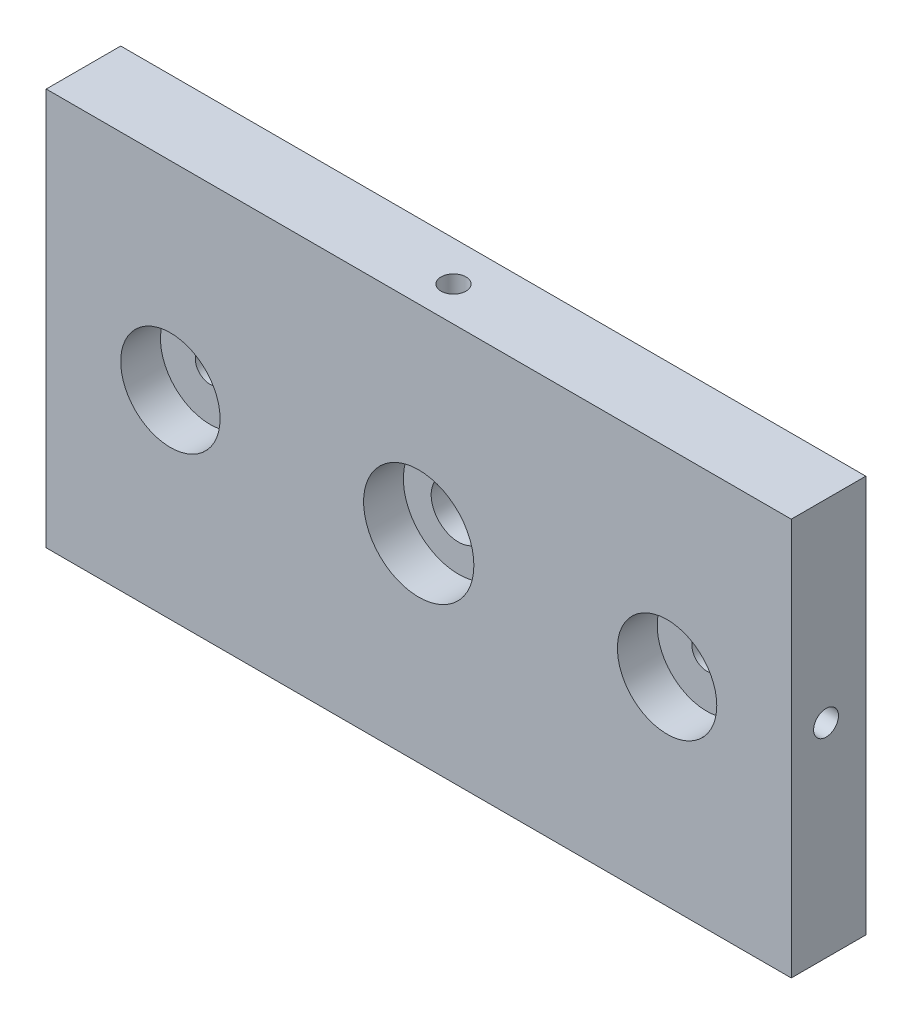
ISO-10303-21;
HEADER;
FILE_DESCRIPTION(('STEP AP214'),'2;1');
FILE_NAME('part.step','',(''),(''),'','','');
FILE_SCHEMA(('AUTOMOTIVE_DESIGN { 1 0 10303 214 1 1 1 1 }'));
ENDSEC;
DATA;
#1=APPLICATION_CONTEXT('core data for automotive mechanical design processes');
#2=APPLICATION_PROTOCOL_DEFINITION('international standard','automotive_design',2000,#1);
#3=PRODUCT_CONTEXT('',#1,'mechanical');
#4=PRODUCT('Part','Part','',(#3));
#5=PRODUCT_RELATED_PRODUCT_CATEGORY('part','',(#4));
#6=PRODUCT_DEFINITION_FORMATION('','',#4);
#7=PRODUCT_DEFINITION_CONTEXT('part definition',#1,'design');
#8=PRODUCT_DEFINITION('design','',#6,#7);
#9=PRODUCT_DEFINITION_SHAPE('','',#8);
#10=(LENGTH_UNIT() NAMED_UNIT(*) SI_UNIT(.MILLI.,.METRE.));
#11=(NAMED_UNIT(*) PLANE_ANGLE_UNIT() SI_UNIT($,.RADIAN.));
#12=(NAMED_UNIT(*) SI_UNIT($,.STERADIAN.) SOLID_ANGLE_UNIT());
#13=UNCERTAINTY_MEASURE_WITH_UNIT(LENGTH_MEASURE(1.E-05),#10,'distance_accuracy_value','');
#14=(GEOMETRIC_REPRESENTATION_CONTEXT(3) GLOBAL_UNCERTAINTY_ASSIGNED_CONTEXT((#13)) GLOBAL_UNIT_ASSIGNED_CONTEXT((#10,
#11,#12)) REPRESENTATION_CONTEXT('',''));
#15=CARTESIAN_POINT('',(0.,0.,0.));
#16=DIRECTION('',(0.,0.,1.));
#17=DIRECTION('',(1.,0.,0.));
#18=AXIS2_PLACEMENT_3D('',#15,#16,#17);
#19=CARTESIAN_POINT('',(-50.,0.,-0.000999999999999265));
#20=DIRECTION('',(0.,0.,1.));
#21=DIRECTION('',(1.,0.,0.));
#22=AXIS2_PLACEMENT_3D('',#19,#20,#21);
#23=CYLINDRICAL_SURFACE('',#22,3.);
#24=CARTESIAN_POINT('',(-50.,0.,7.));
#25=DIRECTION('',(0.,0.,1.));
#26=DIRECTION('',(1.,0.,0.));
#27=AXIS2_PLACEMENT_3D('',#24,#25,#26);
#28=CIRCLE('',#27,3.);
#29=CARTESIAN_POINT('',(-47.,0.,7.));
#30=VERTEX_POINT('',#29);
#31=EDGE_CURVE('E113',#30,#30,#28,.F.);
#32=CARTESIAN_POINT('',(-50.,0.,4.));
#33=DIRECTION('',(0.,0.,-1.));
#34=DIRECTION('',(-1.,0.,0.));
#35=AXIS2_PLACEMENT_3D('',#32,#33,#34);
#36=CIRCLE('',#35,3.);
#37=CARTESIAN_POINT('',(-47.,0.,4.));
#38=VERTEX_POINT('',#37);
#39=EDGE_CURVE('E38',#38,#38,#36,.F.);
#40=CARTESIAN_POINT('',(-47.,0.,7.));
#41=CARTESIAN_POINT('',(-47.,0.,6.96875));
#42=CARTESIAN_POINT('',(-47.,0.,6.9375));
#43=CARTESIAN_POINT('',(-47.,0.,6.875));
#44=CARTESIAN_POINT('',(-47.,0.,6.84375));
#45=CARTESIAN_POINT('',(-47.,0.,6.78125));
#46=CARTESIAN_POINT('',(-47.,0.,6.75));
#47=CARTESIAN_POINT('',(-47.,0.,6.6875));
#48=CARTESIAN_POINT('',(-47.,0.,6.65625));
#49=CARTESIAN_POINT('',(-47.,0.,6.59375));
#50=CARTESIAN_POINT('',(-47.,0.,6.5625));
#51=CARTESIAN_POINT('',(-47.,0.,6.5));
#52=CARTESIAN_POINT('',(-47.,0.,6.46875));
#53=CARTESIAN_POINT('',(-47.,0.,6.40625));
#54=CARTESIAN_POINT('',(-47.,0.,6.375));
#55=CARTESIAN_POINT('',(-47.,0.,6.3125));
#56=CARTESIAN_POINT('',(-47.,0.,6.28125));
#57=CARTESIAN_POINT('',(-47.,0.,6.21875));
#58=CARTESIAN_POINT('',(-47.,0.,6.1875));
#59=CARTESIAN_POINT('',(-47.,0.,6.125));
#60=CARTESIAN_POINT('',(-47.,0.,6.09375));
#61=CARTESIAN_POINT('',(-47.,0.,6.03125));
#62=CARTESIAN_POINT('',(-47.,0.,6.));
#63=CARTESIAN_POINT('',(-47.,0.,5.9375));
#64=CARTESIAN_POINT('',(-47.,0.,5.90625));
#65=CARTESIAN_POINT('',(-47.,0.,5.84375));
#66=CARTESIAN_POINT('',(-47.,0.,5.8125));
#67=CARTESIAN_POINT('',(-47.,0.,5.75));
#68=CARTESIAN_POINT('',(-47.,0.,5.71875));
#69=CARTESIAN_POINT('',(-47.,0.,5.65625));
#70=CARTESIAN_POINT('',(-47.,0.,5.625));
#71=CARTESIAN_POINT('',(-47.,0.,5.5625));
#72=CARTESIAN_POINT('',(-47.,0.,5.53125));
#73=CARTESIAN_POINT('',(-47.,0.,5.46875));
#74=CARTESIAN_POINT('',(-47.,0.,5.4375));
#75=CARTESIAN_POINT('',(-47.,0.,5.375));
#76=CARTESIAN_POINT('',(-47.,0.,5.34375));
#77=CARTESIAN_POINT('',(-47.,0.,5.28125));
#78=CARTESIAN_POINT('',(-47.,0.,5.25));
#79=CARTESIAN_POINT('',(-47.,0.,5.1875));
#80=CARTESIAN_POINT('',(-47.,0.,5.15625));
#81=CARTESIAN_POINT('',(-47.,0.,5.09375));
#82=CARTESIAN_POINT('',(-47.,0.,5.0625));
#83=CARTESIAN_POINT('',(-47.,0.,5.));
#84=CARTESIAN_POINT('',(-47.,0.,4.96875));
#85=CARTESIAN_POINT('',(-47.,0.,4.90625));
#86=CARTESIAN_POINT('',(-47.,0.,4.875));
#87=CARTESIAN_POINT('',(-47.,0.,4.8125));
#88=CARTESIAN_POINT('',(-47.,0.,4.78125));
#89=CARTESIAN_POINT('',(-47.,0.,4.71875));
#90=CARTESIAN_POINT('',(-47.,0.,4.6875));
#91=CARTESIAN_POINT('',(-47.,0.,4.625));
#92=CARTESIAN_POINT('',(-47.,0.,4.59375));
#93=CARTESIAN_POINT('',(-47.,0.,4.53125));
#94=CARTESIAN_POINT('',(-47.,0.,4.5));
#95=CARTESIAN_POINT('',(-47.,0.,4.4375));
#96=CARTESIAN_POINT('',(-47.,0.,4.40625));
#97=CARTESIAN_POINT('',(-47.,0.,4.34375));
#98=CARTESIAN_POINT('',(-47.,0.,4.3125));
#99=CARTESIAN_POINT('',(-47.,0.,4.25));
#100=CARTESIAN_POINT('',(-47.,0.,4.21875));
#101=CARTESIAN_POINT('',(-47.,0.,4.15625));
#102=CARTESIAN_POINT('',(-47.,0.,4.125));
#103=CARTESIAN_POINT('',(-47.,0.,4.0625));
#104=CARTESIAN_POINT('',(-47.,0.,4.03125));
#105=CARTESIAN_POINT('',(-47.,0.,4.));
#106=B_SPLINE_CURVE_WITH_KNOTS('',3,(#40,#41,#42,#43,#44,#45,#46,#47,#48,#49,#50,#51,#52,#53,
#54,#55,#56,#57,#58,#59,#60,#61,#62,#63,#64,#65,#66,#67,#68,#69,#70,#71,#72,#73,#74,#75,#76,#77,
#78,#79,#80,#81,#82,#83,#84,#85,#86,#87,#88,#89,#90,#91,#92,#93,#94,#95,#96,#97,#98,#99,#100,
#101,#102,#103,#104,#105),.UNSPECIFIED.,.F.,.F.,(4,2,2,2,2,2,2,2,2,2,2,2,2,2,2,2,2,2,2,2,2,2,2,
2,2,2,2,2,2,2,2,2,4),(0.,0.0937500000000001,0.1875,0.281249999999999,0.374999999999999,0.46875,
0.5625,0.65625,0.749999999999999,0.843749999999999,0.937499999999999,1.03125,1.125,1.21875,
1.3125,1.40625,1.5,1.59375,1.6875,1.78125,1.875,1.96875,2.0625,2.15625,2.25,2.34375,2.4375,
2.53125,2.625,2.71875,2.8125,2.90625,3.),.UNSPECIFIED.);
#107=EDGE_CURVE('BSEAM34',#30,#38,#106,.T.);
#108=ORIENTED_EDGE('',*,*,#31,.F.);
#109=ORIENTED_EDGE('',*,*,#39,.F.);
#110=ORIENTED_EDGE('',*,*,#107,.T.);
#111=ORIENTED_EDGE('',*,*,#107,.F.);
#112=EDGE_LOOP('',(#108,#110,#109,#111));
#113=FACE_BOUND('',#112,.T.);
#114=ADVANCED_FACE('F34',(#113),#23,.F.);
#115=CARTESIAN_POINT('',(50.,0.,-0.000999999999999265));
#116=DIRECTION('',(0.,0.,1.));
#117=DIRECTION('',(1.,0.,0.));
#118=AXIS2_PLACEMENT_3D('',#115,#116,#117);
#119=CYLINDRICAL_SURFACE('',#118,3.);
#120=CARTESIAN_POINT('',(50.,0.,7.));
#121=DIRECTION('',(0.,0.,1.));
#122=DIRECTION('',(1.,0.,0.));
#123=AXIS2_PLACEMENT_3D('',#120,#121,#122);
#124=CIRCLE('',#123,3.);
#125=CARTESIAN_POINT('',(53.,0.,7.));
#126=VERTEX_POINT('',#125);
#127=EDGE_CURVE('E110',#126,#126,#124,.F.);
#128=CARTESIAN_POINT('',(50.,0.,4.));
#129=DIRECTION('',(0.,0.,-1.));
#130=DIRECTION('',(-1.,0.,0.));
#131=AXIS2_PLACEMENT_3D('',#128,#129,#130);
#132=CIRCLE('',#131,3.);
#133=CARTESIAN_POINT('',(53.,0.,4.));
#134=VERTEX_POINT('',#133);
#135=EDGE_CURVE('E119',#134,#134,#132,.F.);
#136=CARTESIAN_POINT('',(53.,0.,7.));
#137=CARTESIAN_POINT('',(53.,0.,6.96875));
#138=CARTESIAN_POINT('',(53.,0.,6.9375));
#139=CARTESIAN_POINT('',(53.,0.,6.875));
#140=CARTESIAN_POINT('',(53.,0.,6.84375));
#141=CARTESIAN_POINT('',(53.,0.,6.78125));
#142=CARTESIAN_POINT('',(53.,0.,6.75));
#143=CARTESIAN_POINT('',(53.,0.,6.6875));
#144=CARTESIAN_POINT('',(53.,0.,6.65625));
#145=CARTESIAN_POINT('',(53.,0.,6.59375));
#146=CARTESIAN_POINT('',(53.,0.,6.5625));
#147=CARTESIAN_POINT('',(53.,0.,6.5));
#148=CARTESIAN_POINT('',(53.,0.,6.46875));
#149=CARTESIAN_POINT('',(53.,0.,6.40625));
#150=CARTESIAN_POINT('',(53.,0.,6.375));
#151=CARTESIAN_POINT('',(53.,0.,6.3125));
#152=CARTESIAN_POINT('',(53.,0.,6.28125));
#153=CARTESIAN_POINT('',(53.,0.,6.21875));
#154=CARTESIAN_POINT('',(53.,0.,6.1875));
#155=CARTESIAN_POINT('',(53.,0.,6.125));
#156=CARTESIAN_POINT('',(53.,0.,6.09375));
#157=CARTESIAN_POINT('',(53.,0.,6.03125));
#158=CARTESIAN_POINT('',(53.,0.,6.));
#159=CARTESIAN_POINT('',(53.,0.,5.9375));
#160=CARTESIAN_POINT('',(53.,0.,5.90625));
#161=CARTESIAN_POINT('',(53.,0.,5.84375));
#162=CARTESIAN_POINT('',(53.,0.,5.8125));
#163=CARTESIAN_POINT('',(53.,0.,5.75));
#164=CARTESIAN_POINT('',(53.,0.,5.71875));
#165=CARTESIAN_POINT('',(53.,0.,5.65625));
#166=CARTESIAN_POINT('',(53.,0.,5.625));
#167=CARTESIAN_POINT('',(53.,0.,5.5625));
#168=CARTESIAN_POINT('',(53.,0.,5.53125));
#169=CARTESIAN_POINT('',(53.,0.,5.46875));
#170=CARTESIAN_POINT('',(53.,0.,5.4375));
#171=CARTESIAN_POINT('',(53.,0.,5.375));
#172=CARTESIAN_POINT('',(53.,0.,5.34375));
#173=CARTESIAN_POINT('',(53.,0.,5.28125));
#174=CARTESIAN_POINT('',(53.,0.,5.25));
#175=CARTESIAN_POINT('',(53.,0.,5.1875));
#176=CARTESIAN_POINT('',(53.,0.,5.15625));
#177=CARTESIAN_POINT('',(53.,0.,5.09375));
#178=CARTESIAN_POINT('',(53.,0.,5.0625));
#179=CARTESIAN_POINT('',(53.,0.,5.));
#180=CARTESIAN_POINT('',(53.,0.,4.96875));
#181=CARTESIAN_POINT('',(53.,0.,4.90625));
#182=CARTESIAN_POINT('',(53.,0.,4.875));
#183=CARTESIAN_POINT('',(53.,0.,4.8125));
#184=CARTESIAN_POINT('',(53.,0.,4.78125));
#185=CARTESIAN_POINT('',(53.,0.,4.71875));
#186=CARTESIAN_POINT('',(53.,0.,4.6875));
#187=CARTESIAN_POINT('',(53.,0.,4.625));
#188=CARTESIAN_POINT('',(53.,0.,4.59375));
#189=CARTESIAN_POINT('',(53.,0.,4.53125));
#190=CARTESIAN_POINT('',(53.,0.,4.5));
#191=CARTESIAN_POINT('',(53.,0.,4.4375));
#192=CARTESIAN_POINT('',(53.,0.,4.40625));
#193=CARTESIAN_POINT('',(53.,0.,4.34375));
#194=CARTESIAN_POINT('',(53.,0.,4.3125));
#195=CARTESIAN_POINT('',(53.,0.,4.25));
#196=CARTESIAN_POINT('',(53.,0.,4.21875));
#197=CARTESIAN_POINT('',(53.,0.,4.15625));
#198=CARTESIAN_POINT('',(53.,0.,4.125));
#199=CARTESIAN_POINT('',(53.,0.,4.0625));
#200=CARTESIAN_POINT('',(53.,0.,4.03125));
#201=CARTESIAN_POINT('',(53.,0.,4.));
#202=B_SPLINE_CURVE_WITH_KNOTS('',3,(#136,#137,#138,#139,#140,#141,#142,#143,#144,#145,#146,
#147,#148,#149,#150,#151,#152,#153,#154,#155,#156,#157,#158,#159,#160,#161,#162,#163,#164,#165,
#166,#167,#168,#169,#170,#171,#172,#173,#174,#175,#176,#177,#178,#179,#180,#181,#182,#183,#184,
#185,#186,#187,#188,#189,#190,#191,#192,#193,#194,#195,#196,#197,#198,#199,#200,#201),
.UNSPECIFIED.,.F.,.F.,(4,2,2,2,2,2,2,2,2,2,2,2,2,2,2,2,2,2,2,2,2,2,2,2,2,2,2,2,2,2,2,2,4),(0.,
0.0937500000000001,0.1875,0.281249999999999,0.374999999999999,0.46875,0.5625,0.65625,
0.749999999999999,0.843749999999999,0.937499999999999,1.03125,1.125,1.21875,1.3125,1.40625,1.5,
1.59375,1.6875,1.78125,1.875,1.96875,2.0625,2.15625,2.25,2.34375,2.4375,2.53125,2.625,2.71875,
2.8125,2.90625,3.),.UNSPECIFIED.);
#203=EDGE_CURVE('BSEAM188',#126,#134,#202,.T.);
#204=ORIENTED_EDGE('',*,*,#127,.F.);
#205=ORIENTED_EDGE('',*,*,#135,.F.);
#206=ORIENTED_EDGE('',*,*,#203,.T.);
#207=ORIENTED_EDGE('',*,*,#203,.F.);
#208=EDGE_LOOP('',(#204,#206,#205,#207));
#209=FACE_BOUND('',#208,.T.);
#210=ADVANCED_FACE('F188',(#209),#119,.F.);
#211=CARTESIAN_POINT('',(0.,0.,-0.000999999999999265));
#212=DIRECTION('',(0.,0.,1.));
#213=DIRECTION('',(1.,0.,0.));
#214=AXIS2_PLACEMENT_3D('',#211,#212,#213);
#215=CYLINDRICAL_SURFACE('',#214,5.5);
#216=CARTESIAN_POINT('',(0.,0.,0.));
#217=DIRECTION('',(0.,0.,1.));
#218=DIRECTION('',(1.,0.,0.));
#219=AXIS2_PLACEMENT_3D('',#216,#217,#218);
#220=CIRCLE('',#219,5.5);
#221=CARTESIAN_POINT('',(5.5,0.,0.));
#222=VERTEX_POINT('',#221);
#223=EDGE_CURVE('E104',#222,#222,#220,.F.);
#224=CARTESIAN_POINT('',(0.,0.,7.));
#225=DIRECTION('',(0.,0.,1.));
#226=DIRECTION('',(1.,0.,0.));
#227=AXIS2_PLACEMENT_3D('',#224,#225,#226);
#228=CIRCLE('',#227,5.5);
#229=CARTESIAN_POINT('',(5.5,0.,7.));
#230=VERTEX_POINT('',#229);
#231=EDGE_CURVE('E117',#230,#230,#228,.F.);
#232=CARTESIAN_POINT('',(5.5,0.,0.));
#233=CARTESIAN_POINT('',(5.5,0.,0.0729166666666667));
#234=CARTESIAN_POINT('',(5.5,0.,0.145833333333333));
#235=CARTESIAN_POINT('',(5.5,0.,0.291666666666667));
#236=CARTESIAN_POINT('',(5.5,0.,0.364583333333333));
#237=CARTESIAN_POINT('',(5.5,0.,0.510416666666667));
#238=CARTESIAN_POINT('',(5.5,0.,0.583333333333333));
#239=CARTESIAN_POINT('',(5.5,0.,0.729166666666667));
#240=CARTESIAN_POINT('',(5.5,0.,0.802083333333333));
#241=CARTESIAN_POINT('',(5.5,0.,0.947916666666666));
#242=CARTESIAN_POINT('',(5.5,0.,1.02083333333333));
#243=CARTESIAN_POINT('',(5.5,0.,1.16666666666667));
#244=CARTESIAN_POINT('',(5.5,0.,1.23958333333333));
#245=CARTESIAN_POINT('',(5.5,0.,1.38541666666667));
#246=CARTESIAN_POINT('',(5.5,0.,1.45833333333333));
#247=CARTESIAN_POINT('',(5.5,0.,1.60416666666667));
#248=CARTESIAN_POINT('',(5.5,0.,1.67708333333333));
#249=CARTESIAN_POINT('',(5.5,0.,1.82291666666667));
#250=CARTESIAN_POINT('',(5.5,0.,1.89583333333333));
#251=CARTESIAN_POINT('',(5.5,0.,2.04166666666667));
#252=CARTESIAN_POINT('',(5.5,0.,2.11458333333333));
#253=CARTESIAN_POINT('',(5.5,0.,2.26041666666667));
#254=CARTESIAN_POINT('',(5.5,0.,2.33333333333333));
#255=CARTESIAN_POINT('',(5.5,0.,2.47916666666667));
#256=CARTESIAN_POINT('',(5.5,0.,2.55208333333333));
#257=CARTESIAN_POINT('',(5.5,0.,2.69791666666667));
#258=CARTESIAN_POINT('',(5.5,0.,2.77083333333333));
#259=CARTESIAN_POINT('',(5.5,0.,2.91666666666667));
#260=CARTESIAN_POINT('',(5.5,0.,2.98958333333333));
#261=CARTESIAN_POINT('',(5.5,0.,3.13541666666667));
#262=CARTESIAN_POINT('',(5.5,0.,3.20833333333333));
#263=CARTESIAN_POINT('',(5.5,0.,3.35416666666667));
#264=CARTESIAN_POINT('',(5.5,0.,3.42708333333333));
#265=CARTESIAN_POINT('',(5.5,0.,3.57291666666667));
#266=CARTESIAN_POINT('',(5.5,0.,3.64583333333333));
#267=CARTESIAN_POINT('',(5.5,0.,3.79166666666667));
#268=CARTESIAN_POINT('',(5.5,0.,3.86458333333333));
#269=CARTESIAN_POINT('',(5.5,0.,4.01041666666667));
#270=CARTESIAN_POINT('',(5.5,0.,4.08333333333333));
#271=CARTESIAN_POINT('',(5.5,0.,4.22916666666667));
#272=CARTESIAN_POINT('',(5.5,0.,4.30208333333333));
#273=CARTESIAN_POINT('',(5.5,0.,4.44791666666667));
#274=CARTESIAN_POINT('',(5.5,0.,4.52083333333333));
#275=CARTESIAN_POINT('',(5.5,0.,4.66666666666667));
#276=CARTESIAN_POINT('',(5.5,0.,4.73958333333333));
#277=CARTESIAN_POINT('',(5.5,0.,4.88541666666666));
#278=CARTESIAN_POINT('',(5.5,0.,4.95833333333333));
#279=CARTESIAN_POINT('',(5.5,0.,5.10416666666667));
#280=CARTESIAN_POINT('',(5.5,0.,5.17708333333333));
#281=CARTESIAN_POINT('',(5.5,0.,5.32291666666667));
#282=CARTESIAN_POINT('',(5.5,0.,5.39583333333333));
#283=CARTESIAN_POINT('',(5.5,0.,5.54166666666667));
#284=CARTESIAN_POINT('',(5.5,0.,5.61458333333333));
#285=CARTESIAN_POINT('',(5.5,0.,5.76041666666667));
#286=CARTESIAN_POINT('',(5.5,0.,5.83333333333333));
#287=CARTESIAN_POINT('',(5.5,0.,5.97916666666667));
#288=CARTESIAN_POINT('',(5.5,0.,6.05208333333333));
#289=CARTESIAN_POINT('',(5.5,0.,6.19791666666667));
#290=CARTESIAN_POINT('',(5.5,0.,6.27083333333333));
#291=CARTESIAN_POINT('',(5.5,0.,6.41666666666667));
#292=CARTESIAN_POINT('',(5.5,0.,6.48958333333333));
#293=CARTESIAN_POINT('',(5.5,0.,6.63541666666666));
#294=CARTESIAN_POINT('',(5.5,0.,6.70833333333333));
#295=CARTESIAN_POINT('',(5.5,0.,6.85416666666666));
#296=CARTESIAN_POINT('',(5.5,0.,6.92708333333333));
#297=CARTESIAN_POINT('',(5.5,0.,7.));
#298=B_SPLINE_CURVE_WITH_KNOTS('',3,(#232,#233,#234,#235,#236,#237,#238,#239,#240,#241,#242,
#243,#244,#245,#246,#247,#248,#249,#250,#251,#252,#253,#254,#255,#256,#257,#258,#259,#260,#261,
#262,#263,#264,#265,#266,#267,#268,#269,#270,#271,#272,#273,#274,#275,#276,#277,#278,#279,#280,
#281,#282,#283,#284,#285,#286,#287,#288,#289,#290,#291,#292,#293,#294,#295,#296,#297),
.UNSPECIFIED.,.F.,.F.,(4,2,2,2,2,2,2,2,2,2,2,2,2,2,2,2,2,2,2,2,2,2,2,2,2,2,2,2,2,2,2,2,4),(0.,
0.21875,0.4375,0.65625,0.875,1.09375,1.3125,1.53125,1.75,1.96875,2.1875,2.40625,2.625,2.84375,
3.0625,3.28125,3.5,3.71875,3.9375,4.15625,4.375,4.59375,4.8125,5.03125,5.25,5.46875,5.6875,
5.90625,6.125,6.34375,6.5625,6.78125,7.),.UNSPECIFIED.);
#299=EDGE_CURVE('BSEAM163',#222,#230,#298,.T.);
#300=ORIENTED_EDGE('',*,*,#223,.T.);
#301=ORIENTED_EDGE('',*,*,#231,.F.);
#302=ORIENTED_EDGE('',*,*,#299,.T.);
#303=ORIENTED_EDGE('',*,*,#299,.F.);
#304=EDGE_LOOP('',(#300,#302,#301,#303));
#305=FACE_BOUND('',#304,.T.);
#306=ADVANCED_FACE('F163',(#305),#215,.F.);
#307=CARTESIAN_POINT('',(-75.,-40.,15.));
#308=DIRECTION('',(1.,0.,0.));
#309=DIRECTION('',(0.,0.,-1.));
#310=AXIS2_PLACEMENT_3D('',#307,#308,#309);
#311=PLANE('',#310);
#312=CARTESIAN_POINT('',(-75.,0.999999999999994,8.));
#313=DIRECTION('',(-1.,0.,0.));
#314=DIRECTION('',(0.,0.,1.));
#315=AXIS2_PLACEMENT_3D('',#312,#313,#314);
#316=CIRCLE('',#315,2.5);
#317=CARTESIAN_POINT('',(-75.,0.999999999999994,10.5));
#318=VERTEX_POINT('',#317);
#319=EDGE_CURVE('E135',#318,#318,#316,.T.);
#320=ORIENTED_EDGE('',*,*,#319,.F.);
#321=EDGE_LOOP('',(#320));
#322=FACE_BOUND('',#321,.T.);
#323=DIRECTION('',(0.,-1.,0.));
#324=VECTOR('',#323,1.);
#325=CARTESIAN_POINT('',(-75.,-40.,0.));
#326=LINE('',#325,#324);
#327=CARTESIAN_POINT('',(-75.,40.,0.));
#328=VERTEX_POINT('',#327);
#329=CARTESIAN_POINT('',(-75.,-40.,0.));
#330=VERTEX_POINT('',#329);
#331=EDGE_CURVE('E101',#328,#330,#326,.T.);
#332=ORIENTED_EDGE('',*,*,#331,.T.);
#333=DIRECTION('',(0.,0.,-1.));
#334=VECTOR('',#333,1.);
#335=CARTESIAN_POINT('',(-75.,-40.,15.));
#336=LINE('',#335,#334);
#337=CARTESIAN_POINT('',(-75.,-40.,15.));
#338=VERTEX_POINT('',#337);
#339=EDGE_CURVE('E11',#338,#330,#336,.T.);
#340=ORIENTED_EDGE('',*,*,#339,.F.);
#341=DIRECTION('',(0.,-1.,0.));
#342=VECTOR('',#341,1.);
#343=CARTESIAN_POINT('',(-75.,-40.,15.));
#344=LINE('',#343,#342);
#345=CARTESIAN_POINT('',(-75.,40.,15.));
#346=VERTEX_POINT('',#345);
#347=EDGE_CURVE('E88',#346,#338,#344,.T.);
#348=ORIENTED_EDGE('',*,*,#347,.F.);
#349=DIRECTION('',(0.,0.,-1.));
#350=VECTOR('',#349,1.);
#351=CARTESIAN_POINT('',(-75.,40.,15.));
#352=LINE('',#351,#350);
#353=EDGE_CURVE('E97',#346,#328,#352,.T.);
#354=ORIENTED_EDGE('',*,*,#353,.T.);
#355=EDGE_LOOP('',(#332,#340,#348,#354));
#356=FACE_BOUND('',#355,.T.);
#357=ADVANCED_FACE('F36',(#322,#356),#311,.F.);
#358=CARTESIAN_POINT('',(75.,-40.,15.));
#359=DIRECTION('',(0.,1.,0.));
#360=DIRECTION('',(-1.,0.,0.));
#361=AXIS2_PLACEMENT_3D('',#358,#359,#360);
#362=PLANE('',#361);
#363=CARTESIAN_POINT('',(-62.,-40.,8.));
#364=DIRECTION('',(0.,-1.,0.));
#365=DIRECTION('',(1.,0.,0.));
#366=AXIS2_PLACEMENT_3D('',#363,#364,#365);
#367=CIRCLE('',#366,2.5);
#368=CARTESIAN_POINT('',(-59.5,-40.,8.));
#369=VERTEX_POINT('',#368);
#370=EDGE_CURVE('E232',#369,#369,#367,.T.);
#371=ORIENTED_EDGE('',*,*,#370,.F.);
#372=EDGE_LOOP('',(#371));
#373=FACE_BOUND('',#372,.T.);
#374=CARTESIAN_POINT('',(62.,-40.,8.));
#375=DIRECTION('',(0.,-1.,0.));
#376=DIRECTION('',(-1.,0.,0.));
#377=AXIS2_PLACEMENT_3D('',#374,#375,#376);
#378=CIRCLE('',#377,2.5);
#379=CARTESIAN_POINT('',(59.5,-40.,8.));
#380=VERTEX_POINT('',#379);
#381=EDGE_CURVE('E225',#380,#380,#378,.T.);
#382=ORIENTED_EDGE('',*,*,#381,.F.);
#383=EDGE_LOOP('',(#382));
#384=FACE_BOUND('',#383,.T.);
#385=DIRECTION('',(1.,0.,0.));
#386=VECTOR('',#385,1.);
#387=CARTESIAN_POINT('',(75.,-40.,0.));
#388=LINE('',#387,#386);
#389=CARTESIAN_POINT('',(75.,-40.,0.));
#390=VERTEX_POINT('',#389);
#391=EDGE_CURVE('E92',#330,#390,#388,.T.);
#392=ORIENTED_EDGE('',*,*,#391,.T.);
#393=DIRECTION('',(0.,0.,-1.));
#394=VECTOR('',#393,1.);
#395=CARTESIAN_POINT('',(75.,-40.,15.));
#396=LINE('',#395,#394);
#397=CARTESIAN_POINT('',(75.,-40.,15.));
#398=VERTEX_POINT('',#397);
#399=EDGE_CURVE('E44',#398,#390,#396,.T.);
#400=ORIENTED_EDGE('',*,*,#399,.F.);
#401=DIRECTION('',(1.,0.,0.));
#402=VECTOR('',#401,1.);
#403=CARTESIAN_POINT('',(75.,-40.,15.));
#404=LINE('',#403,#402);
#405=EDGE_CURVE('E83',#338,#398,#404,.T.);
#406=ORIENTED_EDGE('',*,*,#405,.F.);
#407=ORIENTED_EDGE('',*,*,#339,.T.);
#408=EDGE_LOOP('',(#392,#400,#406,#407));
#409=FACE_BOUND('',#408,.T.);
#410=ADVANCED_FACE('F91',(#373,#384,#409),#362,.F.);
#411=CARTESIAN_POINT('',(75.,-40.,15.));
#412=DIRECTION('',(-1.,0.,0.));
#413=DIRECTION('',(0.,0.,1.));
#414=AXIS2_PLACEMENT_3D('',#411,#412,#413);
#415=PLANE('',#414);
#416=CARTESIAN_POINT('',(75.,0.999999999999994,8.));
#417=DIRECTION('',(-1.,0.,0.));
#418=DIRECTION('',(0.,0.,1.));
#419=AXIS2_PLACEMENT_3D('',#416,#417,#418);
#420=CIRCLE('',#419,2.5);
#421=CARTESIAN_POINT('',(75.,0.999999999999994,10.5));
#422=VERTEX_POINT('',#421);
#423=EDGE_CURVE('E217',#422,#422,#420,.T.);
#424=ORIENTED_EDGE('',*,*,#423,.T.);
#425=EDGE_LOOP('',(#424));
#426=FACE_BOUND('',#425,.T.);
#427=DIRECTION('',(0.,1.,0.));
#428=VECTOR('',#427,1.);
#429=CARTESIAN_POINT('',(75.,-40.,0.));
#430=LINE('',#429,#428);
#431=CARTESIAN_POINT('',(75.,40.,0.));
#432=VERTEX_POINT('',#431);
#433=EDGE_CURVE('E70',#390,#432,#430,.T.);
#434=ORIENTED_EDGE('',*,*,#433,.T.);
#435=DIRECTION('',(0.,0.,-1.));
#436=VECTOR('',#435,1.);
#437=CARTESIAN_POINT('',(75.,40.,15.));
#438=LINE('',#437,#436);
#439=CARTESIAN_POINT('',(75.,40.,15.));
#440=VERTEX_POINT('',#439);
#441=EDGE_CURVE('E93',#440,#432,#438,.T.);
#442=ORIENTED_EDGE('',*,*,#441,.F.);
#443=DIRECTION('',(0.,1.,0.));
#444=VECTOR('',#443,1.);
#445=CARTESIAN_POINT('',(75.,-40.,15.));
#446=LINE('',#445,#444);
#447=EDGE_CURVE('E86',#398,#440,#446,.T.);
#448=ORIENTED_EDGE('',*,*,#447,.F.);
#449=ORIENTED_EDGE('',*,*,#399,.T.);
#450=EDGE_LOOP('',(#434,#442,#448,#449));
#451=FACE_BOUND('',#450,.T.);
#452=ADVANCED_FACE('F95',(#426,#451),#415,.F.);
#453=CARTESIAN_POINT('',(75.,40.,15.));
#454=DIRECTION('',(0.,-1.,0.));
#455=DIRECTION('',(1.,0.,0.));
#456=AXIS2_PLACEMENT_3D('',#453,#454,#455);
#457=PLANE('',#456);
#458=CARTESIAN_POINT('',(0.,40.,8.00000000000001));
#459=DIRECTION('',(0.,1.,0.));
#460=DIRECTION('',(-1.,0.,0.));
#461=AXIS2_PLACEMENT_3D('',#458,#459,#460);
#462=CIRCLE('',#461,2.5);
#463=CARTESIAN_POINT('',(-2.5,40.,8.00000000000001));
#464=VERTEX_POINT('',#463);
#465=EDGE_CURVE('E237',#464,#464,#462,.T.);
#466=ORIENTED_EDGE('',*,*,#465,.F.);
#467=EDGE_LOOP('',(#466));
#468=FACE_BOUND('',#467,.T.);
#469=DIRECTION('',(-1.,0.,0.));
#470=VECTOR('',#469,1.);
#471=CARTESIAN_POINT('',(75.,40.,0.));
#472=LINE('',#471,#470);
#473=EDGE_CURVE('E76',#432,#328,#472,.T.);
#474=ORIENTED_EDGE('',*,*,#473,.T.);
#475=ORIENTED_EDGE('',*,*,#353,.F.);
#476=DIRECTION('',(-1.,0.,0.));
#477=VECTOR('',#476,1.);
#478=CARTESIAN_POINT('',(75.,40.,15.));
#479=LINE('',#478,#477);
#480=EDGE_CURVE('E53',#440,#346,#479,.T.);
#481=ORIENTED_EDGE('',*,*,#480,.F.);
#482=ORIENTED_EDGE('',*,*,#441,.T.);
#483=EDGE_LOOP('',(#474,#475,#481,#482));
#484=FACE_BOUND('',#483,.T.);
#485=ADVANCED_FACE('F174',(#468,#484),#457,.F.);
#486=CARTESIAN_POINT('',(0.,0.,15.));
#487=DIRECTION('',(0.,0.,1.));
#488=DIRECTION('',(1.,0.,0.));
#489=AXIS2_PLACEMENT_3D('',#486,#487,#488);
#490=PLANE('',#489);
#491=CARTESIAN_POINT('',(50.,0.,15.));
#492=DIRECTION('',(0.,0.,1.));
#493=DIRECTION('',(1.,0.,0.));
#494=AXIS2_PLACEMENT_3D('',#491,#492,#493);
#495=CIRCLE('',#494,10.);
#496=CARTESIAN_POINT('',(60.,0.,15.));
#497=VERTEX_POINT('',#496);
#498=EDGE_CURVE('E125',#497,#497,#495,.T.);
#499=ORIENTED_EDGE('',*,*,#498,.F.);
#500=EDGE_LOOP('',(#499));
#501=FACE_BOUND('',#500,.T.);
#502=CARTESIAN_POINT('',(-50.,0.,15.));
#503=DIRECTION('',(0.,0.,1.));
#504=DIRECTION('',(1.,0.,0.));
#505=AXIS2_PLACEMENT_3D('',#502,#503,#504);
#506=CIRCLE('',#505,10.);
#507=CARTESIAN_POINT('',(-40.,0.,15.));
#508=VERTEX_POINT('',#507);
#509=EDGE_CURVE('E148',#508,#508,#506,.T.);
#510=ORIENTED_EDGE('',*,*,#509,.F.);
#511=EDGE_LOOP('',(#510));
#512=FACE_BOUND('',#511,.T.);
#513=CARTESIAN_POINT('',(0.,0.,15.));
#514=DIRECTION('',(0.,0.,1.));
#515=DIRECTION('',(1.,0.,0.));
#516=AXIS2_PLACEMENT_3D('',#513,#514,#515);
#517=CIRCLE('',#516,11.1);
#518=CARTESIAN_POINT('',(11.1,0.,15.));
#519=VERTEX_POINT('',#518);
#520=EDGE_CURVE('E147',#519,#519,#517,.T.);
#521=ORIENTED_EDGE('',*,*,#520,.F.);
#522=EDGE_LOOP('',(#521));
#523=FACE_BOUND('',#522,.T.);
#524=ORIENTED_EDGE('',*,*,#347,.T.);
#525=ORIENTED_EDGE('',*,*,#405,.T.);
#526=ORIENTED_EDGE('',*,*,#447,.T.);
#527=ORIENTED_EDGE('',*,*,#480,.T.);
#528=EDGE_LOOP('',(#524,#525,#526,#527));
#529=FACE_BOUND('',#528,.T.);
#530=ADVANCED_FACE('F84',(#501,#512,#523,#529),#490,.T.);
#531=CARTESIAN_POINT('',(0.,0.,0.));
#532=DIRECTION('',(0.,0.,1.));
#533=DIRECTION('',(1.,0.,0.));
#534=AXIS2_PLACEMENT_3D('',#531,#532,#533);
#535=PLANE('',#534);
#536=CARTESIAN_POINT('',(50.,0.,0.));
#537=DIRECTION('',(0.,0.,-1.));
#538=DIRECTION('',(-1.,0.,0.));
#539=AXIS2_PLACEMENT_3D('',#536,#537,#538);
#540=CIRCLE('',#539,5.);
#541=CARTESIAN_POINT('',(45.,0.,0.));
#542=VERTEX_POINT('',#541);
#543=EDGE_CURVE('E127',#542,#542,#540,.T.);
#544=ORIENTED_EDGE('',*,*,#543,.F.);
#545=EDGE_LOOP('',(#544));
#546=FACE_BOUND('',#545,.T.);
#547=CARTESIAN_POINT('',(-50.,0.,0.));
#548=DIRECTION('',(0.,0.,-1.));
#549=DIRECTION('',(-1.,0.,0.));
#550=AXIS2_PLACEMENT_3D('',#547,#548,#549);
#551=CIRCLE('',#550,5.);
#552=CARTESIAN_POINT('',(-55.,0.,0.));
#553=VERTEX_POINT('',#552);
#554=EDGE_CURVE('E140',#553,#553,#551,.T.);
#555=ORIENTED_EDGE('',*,*,#554,.F.);
#556=EDGE_LOOP('',(#555));
#557=FACE_BOUND('',#556,.T.);
#558=ORIENTED_EDGE('',*,*,#223,.F.);
#559=EDGE_LOOP('',(#558));
#560=FACE_BOUND('',#559,.T.);
#561=ORIENTED_EDGE('',*,*,#331,.F.);
#562=ORIENTED_EDGE('',*,*,#473,.F.);
#563=ORIENTED_EDGE('',*,*,#433,.F.);
#564=ORIENTED_EDGE('',*,*,#391,.F.);
#565=EDGE_LOOP('',(#561,#562,#563,#564));
#566=FACE_BOUND('',#565,.T.);
#567=ADVANCED_FACE('F166',(#546,#557,#560,#566),#535,.F.);
#568=CARTESIAN_POINT('',(50.,0.,7.));
#569=DIRECTION('',(0.,0.,1.));
#570=DIRECTION('',(1.,0.,0.));
#571=AXIS2_PLACEMENT_3D('',#568,#569,#570);
#572=PLANE('',#571);
#573=CARTESIAN_POINT('',(50.,0.,7.));
#574=DIRECTION('',(0.,0.,1.));
#575=DIRECTION('',(1.,0.,0.));
#576=AXIS2_PLACEMENT_3D('',#573,#574,#575);
#577=CIRCLE('',#576,10.);
#578=CARTESIAN_POINT('',(60.,0.,7.));
#579=VERTEX_POINT('',#578);
#580=EDGE_CURVE('E151',#579,#579,#577,.T.);
#581=ORIENTED_EDGE('',*,*,#580,.T.);
#582=EDGE_LOOP('',(#581));
#583=FACE_BOUND('',#582,.T.);
#584=ORIENTED_EDGE('',*,*,#127,.T.);
#585=EDGE_LOOP('',(#584));
#586=FACE_BOUND('',#585,.T.);
#587=ADVANCED_FACE('F169',(#583,#586),#572,.T.);
#588=CARTESIAN_POINT('',(50.,0.,7.));
#589=DIRECTION('',(0.,0.,1.));
#590=DIRECTION('',(1.,0.,0.));
#591=AXIS2_PLACEMENT_3D('',#588,#589,#590);
#592=CYLINDRICAL_SURFACE('',#591,10.);
#593=ORIENTED_EDGE('',*,*,#580,.F.);
#594=EDGE_LOOP('',(#593));
#595=FACE_BOUND('',#594,.T.);
#596=ORIENTED_EDGE('',*,*,#498,.T.);
#597=EDGE_LOOP('',(#596));
#598=FACE_BOUND('',#597,.T.);
#599=ADVANCED_FACE('F304',(#595,#598),#592,.F.);
#600=CARTESIAN_POINT('',(-50.,0.,7.));
#601=DIRECTION('',(0.,0.,1.));
#602=DIRECTION('',(1.,0.,0.));
#603=AXIS2_PLACEMENT_3D('',#600,#601,#602);
#604=PLANE('',#603);
#605=CARTESIAN_POINT('',(-50.,0.,7.));
#606=DIRECTION('',(0.,0.,1.));
#607=DIRECTION('',(1.,0.,0.));
#608=AXIS2_PLACEMENT_3D('',#605,#606,#607);
#609=CIRCLE('',#608,10.);
#610=CARTESIAN_POINT('',(-40.,0.,7.));
#611=VERTEX_POINT('',#610);
#612=EDGE_CURVE('E144',#611,#611,#609,.T.);
#613=ORIENTED_EDGE('',*,*,#612,.T.);
#614=EDGE_LOOP('',(#613));
#615=FACE_BOUND('',#614,.T.);
#616=ORIENTED_EDGE('',*,*,#31,.T.);
#617=EDGE_LOOP('',(#616));
#618=FACE_BOUND('',#617,.T.);
#619=ADVANCED_FACE('F300',(#615,#618),#604,.T.);
#620=CARTESIAN_POINT('',(-50.,0.,7.));
#621=DIRECTION('',(0.,0.,1.));
#622=DIRECTION('',(1.,0.,0.));
#623=AXIS2_PLACEMENT_3D('',#620,#621,#622);
#624=CYLINDRICAL_SURFACE('',#623,10.);
#625=ORIENTED_EDGE('',*,*,#612,.F.);
#626=EDGE_LOOP('',(#625));
#627=FACE_BOUND('',#626,.T.);
#628=ORIENTED_EDGE('',*,*,#509,.T.);
#629=EDGE_LOOP('',(#628));
#630=FACE_BOUND('',#629,.T.);
#631=ADVANCED_FACE('F303',(#627,#630),#624,.F.);
#632=CARTESIAN_POINT('',(0.,0.,7.));
#633=DIRECTION('',(0.,0.,1.));
#634=DIRECTION('',(1.,0.,0.));
#635=AXIS2_PLACEMENT_3D('',#632,#633,#634);
#636=PLANE('',#635);
#637=CARTESIAN_POINT('',(0.,0.,7.));
#638=DIRECTION('',(0.,0.,1.));
#639=DIRECTION('',(1.,0.,0.));
#640=AXIS2_PLACEMENT_3D('',#637,#638,#639);
#641=CIRCLE('',#640,11.1);
#642=CARTESIAN_POINT('',(11.1,0.,7.));
#643=VERTEX_POINT('',#642);
#644=EDGE_CURVE('E114',#643,#643,#641,.T.);
#645=ORIENTED_EDGE('',*,*,#644,.T.);
#646=EDGE_LOOP('',(#645));
#647=FACE_BOUND('',#646,.T.);
#648=ORIENTED_EDGE('',*,*,#231,.T.);
#649=EDGE_LOOP('',(#648));
#650=FACE_BOUND('',#649,.T.);
#651=ADVANCED_FACE('F308',(#647,#650),#636,.T.);
#652=CARTESIAN_POINT('',(0.,0.,7.));
#653=DIRECTION('',(0.,0.,1.));
#654=DIRECTION('',(1.,0.,0.));
#655=AXIS2_PLACEMENT_3D('',#652,#653,#654);
#656=CYLINDRICAL_SURFACE('',#655,11.1);
#657=ORIENTED_EDGE('',*,*,#644,.F.);
#658=EDGE_LOOP('',(#657));
#659=FACE_BOUND('',#658,.T.);
#660=ORIENTED_EDGE('',*,*,#520,.T.);
#661=EDGE_LOOP('',(#660));
#662=FACE_BOUND('',#661,.T.);
#663=ADVANCED_FACE('F199',(#659,#662),#656,.F.);
#664=CARTESIAN_POINT('',(-50.,0.,4.));
#665=DIRECTION('',(0.,0.,-1.));
#666=DIRECTION('',(-1.,0.,0.));
#667=AXIS2_PLACEMENT_3D('',#664,#665,#666);
#668=PLANE('',#667);
#669=CARTESIAN_POINT('',(-50.,0.,4.));
#670=DIRECTION('',(0.,0.,-1.));
#671=DIRECTION('',(-1.,0.,0.));
#672=AXIS2_PLACEMENT_3D('',#669,#670,#671);
#673=CIRCLE('',#672,5.);
#674=CARTESIAN_POINT('',(-55.,0.,4.));
#675=VERTEX_POINT('',#674);
#676=EDGE_CURVE('E132',#675,#675,#673,.T.);
#677=ORIENTED_EDGE('',*,*,#676,.T.);
#678=EDGE_LOOP('',(#677));
#679=FACE_BOUND('',#678,.T.);
#680=ORIENTED_EDGE('',*,*,#39,.T.);
#681=EDGE_LOOP('',(#680));
#682=FACE_BOUND('',#681,.T.);
#683=ADVANCED_FACE('F293',(#679,#682),#668,.T.);
#684=CARTESIAN_POINT('',(-50.,0.,4.));
#685=DIRECTION('',(0.,0.,-1.));
#686=DIRECTION('',(-1.,0.,0.));
#687=AXIS2_PLACEMENT_3D('',#684,#685,#686);
#688=CYLINDRICAL_SURFACE('',#687,5.);
#689=ORIENTED_EDGE('',*,*,#676,.F.);
#690=EDGE_LOOP('',(#689));
#691=FACE_BOUND('',#690,.T.);
#692=ORIENTED_EDGE('',*,*,#554,.T.);
#693=EDGE_LOOP('',(#692));
#694=FACE_BOUND('',#693,.T.);
#695=ADVANCED_FACE('F289',(#691,#694),#688,.F.);
#696=CARTESIAN_POINT('',(50.,0.,4.));
#697=DIRECTION('',(0.,0.,-1.));
#698=DIRECTION('',(-1.,0.,0.));
#699=AXIS2_PLACEMENT_3D('',#696,#697,#698);
#700=PLANE('',#699);
#701=CARTESIAN_POINT('',(50.,0.,4.));
#702=DIRECTION('',(0.,0.,-1.));
#703=DIRECTION('',(-1.,0.,0.));
#704=AXIS2_PLACEMENT_3D('',#701,#702,#703);
#705=CIRCLE('',#704,5.);
#706=CARTESIAN_POINT('',(45.,0.,4.));
#707=VERTEX_POINT('',#706);
#708=EDGE_CURVE('E121',#707,#707,#705,.T.);
#709=ORIENTED_EDGE('',*,*,#708,.T.);
#710=EDGE_LOOP('',(#709));
#711=FACE_BOUND('',#710,.T.);
#712=ORIENTED_EDGE('',*,*,#135,.T.);
#713=EDGE_LOOP('',(#712));
#714=FACE_BOUND('',#713,.T.);
#715=ADVANCED_FACE('F286',(#711,#714),#700,.T.);
#716=CARTESIAN_POINT('',(50.,0.,4.));
#717=DIRECTION('',(0.,0.,-1.));
#718=DIRECTION('',(-1.,0.,0.));
#719=AXIS2_PLACEMENT_3D('',#716,#717,#718);
#720=CYLINDRICAL_SURFACE('',#719,5.);
#721=ORIENTED_EDGE('',*,*,#708,.F.);
#722=EDGE_LOOP('',(#721));
#723=FACE_BOUND('',#722,.T.);
#724=ORIENTED_EDGE('',*,*,#543,.T.);
#725=EDGE_LOOP('',(#724));
#726=FACE_BOUND('',#725,.T.);
#727=ADVANCED_FACE('F284',(#723,#726),#720,.F.);
#728=CARTESIAN_POINT('',(-65.,0.999999999999994,8.));
#729=DIRECTION('',(-1.,0.,0.));
#730=DIRECTION('',(0.,0.,1.));
#731=AXIS2_PLACEMENT_3D('',#728,#729,#730);
#732=CYLINDRICAL_SURFACE('',#731,2.5);
#733=CARTESIAN_POINT('',(-65.,0.999999999999994,8.));
#734=DIRECTION('',(-1.,0.,0.));
#735=DIRECTION('',(0.,0.,1.));
#736=AXIS2_PLACEMENT_3D('',#733,#734,#735);
#737=CIRCLE('',#736,2.5);
#738=CARTESIAN_POINT('',(-65.,0.999999999999994,10.5));
#739=VERTEX_POINT('',#738);
#740=EDGE_CURVE('E143',#739,#739,#737,.T.);
#741=ORIENTED_EDGE('',*,*,#740,.F.);
#742=EDGE_LOOP('',(#741));
#743=FACE_BOUND('',#742,.T.);
#744=ORIENTED_EDGE('',*,*,#319,.T.);
#745=EDGE_LOOP('',(#744));
#746=FACE_BOUND('',#745,.T.);
#747=ADVANCED_FACE('F280',(#743,#746),#732,.F.);
#748=CARTESIAN_POINT('',(-65.,0.999999999999994,8.));
#749=DIRECTION('',(-1.,0.,0.));
#750=DIRECTION('',(0.,0.,1.));
#751=AXIS2_PLACEMENT_3D('',#748,#749,#750);
#752=PLANE('',#751);
#753=ORIENTED_EDGE('',*,*,#740,.T.);
#754=EDGE_LOOP('',(#753));
#755=FACE_BOUND('',#754,.T.);
#756=ADVANCED_FACE('F277',(#755),#752,.T.);
#757=CARTESIAN_POINT('',(65.,0.999999999999994,8.));
#758=DIRECTION('',(1.,0.,0.));
#759=DIRECTION('',(0.,0.,-1.));
#760=AXIS2_PLACEMENT_3D('',#757,#758,#759);
#761=CYLINDRICAL_SURFACE('',#760,2.5);
#762=CARTESIAN_POINT('',(65.,0.999999999999994,8.));
#763=DIRECTION('',(-1.,0.,0.));
#764=DIRECTION('',(0.,0.,1.));
#765=AXIS2_PLACEMENT_3D('',#762,#763,#764);
#766=CIRCLE('',#765,2.5);
#767=CARTESIAN_POINT('',(65.,0.999999999999994,10.5));
#768=VERTEX_POINT('',#767);
#769=EDGE_CURVE('E214',#768,#768,#766,.T.);
#770=ORIENTED_EDGE('',*,*,#769,.T.);
#771=EDGE_LOOP('',(#770));
#772=FACE_BOUND('',#771,.T.);
#773=ORIENTED_EDGE('',*,*,#423,.F.);
#774=EDGE_LOOP('',(#773));
#775=FACE_BOUND('',#774,.T.);
#776=ADVANCED_FACE('F273',(#772,#775),#761,.F.);
#777=CARTESIAN_POINT('',(65.,0.999999999999994,8.));
#778=DIRECTION('',(1.,0.,0.));
#779=DIRECTION('',(0.,0.,1.));
#780=AXIS2_PLACEMENT_3D('',#777,#778,#779);
#781=PLANE('',#780);
#782=ORIENTED_EDGE('',*,*,#769,.F.);
#783=EDGE_LOOP('',(#782));
#784=FACE_BOUND('',#783,.T.);
#785=ADVANCED_FACE('F269',(#784),#781,.T.);
#786=CARTESIAN_POINT('',(62.,-30.,8.));
#787=DIRECTION('',(0.,-1.,0.));
#788=DIRECTION('',(1.,0.,0.));
#789=AXIS2_PLACEMENT_3D('',#786,#787,#788);
#790=CYLINDRICAL_SURFACE('',#789,2.5);
#791=CARTESIAN_POINT('',(62.,-30.,8.));
#792=DIRECTION('',(0.,-1.,0.));
#793=DIRECTION('',(-1.,0.,0.));
#794=AXIS2_PLACEMENT_3D('',#791,#792,#793);
#795=CIRCLE('',#794,2.5);
#796=CARTESIAN_POINT('',(59.5,-30.,8.));
#797=VERTEX_POINT('',#796);
#798=EDGE_CURVE('E228',#797,#797,#795,.T.);
#799=ORIENTED_EDGE('',*,*,#798,.F.);
#800=EDGE_LOOP('',(#799));
#801=FACE_BOUND('',#800,.T.);
#802=ORIENTED_EDGE('',*,*,#381,.T.);
#803=EDGE_LOOP('',(#802));
#804=FACE_BOUND('',#803,.T.);
#805=ADVANCED_FACE('F265',(#801,#804),#790,.F.);
#806=CARTESIAN_POINT('',(62.,-30.,8.));
#807=DIRECTION('',(0.,1.,0.));
#808=DIRECTION('',(-1.,0.,0.));
#809=AXIS2_PLACEMENT_3D('',#806,#807,#808);
#810=PLANE('',#809);
#811=ORIENTED_EDGE('',*,*,#798,.T.);
#812=EDGE_LOOP('',(#811));
#813=FACE_BOUND('',#812,.T.);
#814=ADVANCED_FACE('F261',(#813),#810,.F.);
#815=CARTESIAN_POINT('',(-62.,-30.,8.));
#816=DIRECTION('',(0.,-1.,0.));
#817=DIRECTION('',(1.,0.,0.));
#818=AXIS2_PLACEMENT_3D('',#815,#816,#817);
#819=CYLINDRICAL_SURFACE('',#818,2.5);
#820=CARTESIAN_POINT('',(-62.,-30.,8.));
#821=DIRECTION('',(0.,-1.,0.));
#822=DIRECTION('',(1.,0.,0.));
#823=AXIS2_PLACEMENT_3D('',#820,#821,#822);
#824=CIRCLE('',#823,2.5);
#825=CARTESIAN_POINT('',(-59.5,-30.,8.));
#826=VERTEX_POINT('',#825);
#827=EDGE_CURVE('E222',#826,#826,#824,.T.);
#828=ORIENTED_EDGE('',*,*,#827,.F.);
#829=EDGE_LOOP('',(#828));
#830=FACE_BOUND('',#829,.T.);
#831=ORIENTED_EDGE('',*,*,#370,.T.);
#832=EDGE_LOOP('',(#831));
#833=FACE_BOUND('',#832,.T.);
#834=ADVANCED_FACE('F255',(#830,#833),#819,.F.);
#835=CARTESIAN_POINT('',(-62.,-30.,8.));
#836=DIRECTION('',(0.,-1.,0.));
#837=DIRECTION('',(1.,0.,0.));
#838=AXIS2_PLACEMENT_3D('',#835,#836,#837);
#839=PLANE('',#838);
#840=ORIENTED_EDGE('',*,*,#827,.T.);
#841=EDGE_LOOP('',(#840));
#842=FACE_BOUND('',#841,.T.);
#843=ADVANCED_FACE('F248',(#842),#839,.T.);
#844=CARTESIAN_POINT('',(0.,30.,8.00000000000001));
#845=DIRECTION('',(0.,1.,0.));
#846=DIRECTION('',(-1.,0.,0.));
#847=AXIS2_PLACEMENT_3D('',#844,#845,#846);
#848=CYLINDRICAL_SURFACE('',#847,2.5);
#849=CARTESIAN_POINT('',(0.,30.,8.00000000000001));
#850=DIRECTION('',(0.,1.,0.));
#851=DIRECTION('',(-1.,0.,0.));
#852=AXIS2_PLACEMENT_3D('',#849,#850,#851);
#853=CIRCLE('',#852,2.5);
#854=CARTESIAN_POINT('',(-2.5,30.,8.00000000000001));
#855=VERTEX_POINT('',#854);
#856=EDGE_CURVE('E229',#855,#855,#853,.T.);
#857=ORIENTED_EDGE('',*,*,#856,.F.);
#858=EDGE_LOOP('',(#857));
#859=FACE_BOUND('',#858,.T.);
#860=ORIENTED_EDGE('',*,*,#465,.T.);
#861=EDGE_LOOP('',(#860));
#862=FACE_BOUND('',#861,.T.);
#863=ADVANCED_FACE('F245',(#859,#862),#848,.F.);
#864=CARTESIAN_POINT('',(0.,30.,8.00000000000001));
#865=DIRECTION('',(0.,1.,0.));
#866=DIRECTION('',(-1.,0.,0.));
#867=AXIS2_PLACEMENT_3D('',#864,#865,#866);
#868=PLANE('',#867);
#869=ORIENTED_EDGE('',*,*,#856,.T.);
#870=EDGE_LOOP('',(#869));
#871=FACE_BOUND('',#870,.T.);
#872=ADVANCED_FACE('F243',(#871),#868,.T.);
#873=CLOSED_SHELL('',(#114,#210,#306,#357,#410,#452,#485,#530,#567,#587,#599,#619,#631,#651,
#663,#683,#695,#715,#727,#747,#756,#776,#785,#805,#814,#834,#843,#863,#872));
#874=MANIFOLD_SOLID_BREP('B2',#873);
#875=ADVANCED_BREP_SHAPE_REPRESENTATION('',(#18,#874),#14);
#876=SHAPE_DEFINITION_REPRESENTATION(#9,#875);
ENDSEC;
END-ISO-10303-21;
